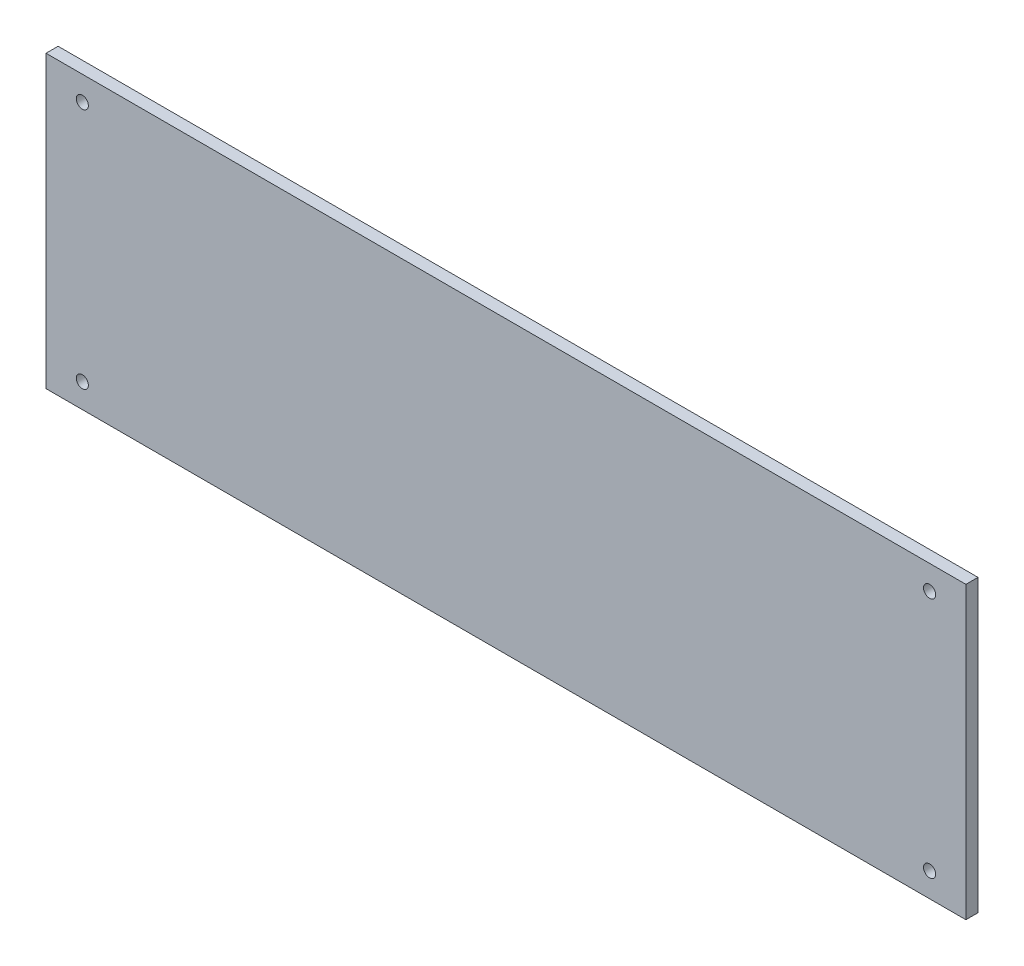
ISO-10303-21;
HEADER;
FILE_DESCRIPTION(('STEP AP214'),'2;1');
FILE_NAME('part.step','',(''),(''),'','','');
FILE_SCHEMA(('AUTOMOTIVE_DESIGN { 1 0 10303 214 1 1 1 1 }'));
ENDSEC;
DATA;
#1=APPLICATION_CONTEXT('core data for automotive mechanical design processes');
#2=APPLICATION_PROTOCOL_DEFINITION('international standard','automotive_design',2000,#1);
#3=PRODUCT_CONTEXT('',#1,'mechanical');
#4=PRODUCT('Part','Part','',(#3));
#5=PRODUCT_RELATED_PRODUCT_CATEGORY('part','',(#4));
#6=PRODUCT_DEFINITION_FORMATION('','',#4);
#7=PRODUCT_DEFINITION_CONTEXT('part definition',#1,'design');
#8=PRODUCT_DEFINITION('design','',#6,#7);
#9=PRODUCT_DEFINITION_SHAPE('','',#8);
#10=(LENGTH_UNIT() NAMED_UNIT(*) SI_UNIT(.MILLI.,.METRE.));
#11=(NAMED_UNIT(*) PLANE_ANGLE_UNIT() SI_UNIT($,.RADIAN.));
#12=(NAMED_UNIT(*) SI_UNIT($,.STERADIAN.) SOLID_ANGLE_UNIT());
#13=UNCERTAINTY_MEASURE_WITH_UNIT(LENGTH_MEASURE(1.E-05),#10,'distance_accuracy_value','');
#14=(GEOMETRIC_REPRESENTATION_CONTEXT(3) GLOBAL_UNCERTAINTY_ASSIGNED_CONTEXT((#13)) GLOBAL_UNIT_ASSIGNED_CONTEXT((#10,
#11,#12)) REPRESENTATION_CONTEXT('',''));
#15=CARTESIAN_POINT('',(0.,0.,0.));
#16=DIRECTION('',(0.,0.,1.));
#17=DIRECTION('',(1.,0.,0.));
#18=AXIS2_PLACEMENT_3D('',#15,#16,#17);
#19=CARTESIAN_POINT('',(241.3,-76.2,6.35));
#20=DIRECTION('',(-1.,0.,0.));
#21=DIRECTION('',(0.,0.,1.));
#22=AXIS2_PLACEMENT_3D('',#19,#20,#21);
#23=PLANE('',#22);
#24=DIRECTION('',(0.,1.,0.));
#25=VECTOR('',#24,1.);
#26=CARTESIAN_POINT('',(241.3,-76.2,0.));
#27=LINE('',#26,#25);
#28=CARTESIAN_POINT('',(241.3,-76.2,0.));
#29=VERTEX_POINT('',#28);
#30=CARTESIAN_POINT('',(241.3,76.2,0.));
#31=VERTEX_POINT('',#30);
#32=EDGE_CURVE('E111',#29,#31,#27,.T.);
#33=ORIENTED_EDGE('',*,*,#32,.T.);
#34=DIRECTION('',(0.,0.,-1.));
#35=VECTOR('',#34,1.);
#36=CARTESIAN_POINT('',(241.3,76.2,6.35));
#37=LINE('',#36,#35);
#38=CARTESIAN_POINT('',(241.3,76.2,6.35));
#39=VERTEX_POINT('',#38);
#40=EDGE_CURVE('E11',#39,#31,#37,.T.);
#41=ORIENTED_EDGE('',*,*,#40,.F.);
#42=DIRECTION('',(0.,1.,0.));
#43=VECTOR('',#42,1.);
#44=CARTESIAN_POINT('',(241.3,-76.2,6.35));
#45=LINE('',#44,#43);
#46=CARTESIAN_POINT('',(241.3,-76.2,6.35));
#47=VERTEX_POINT('',#46);
#48=EDGE_CURVE('E95',#47,#39,#45,.T.);
#49=ORIENTED_EDGE('',*,*,#48,.F.);
#50=DIRECTION('',(0.,0.,-1.));
#51=VECTOR('',#50,1.);
#52=CARTESIAN_POINT('',(241.3,-76.2,6.35));
#53=LINE('',#52,#51);
#54=EDGE_CURVE('E107',#47,#29,#53,.T.);
#55=ORIENTED_EDGE('',*,*,#54,.T.);
#56=EDGE_LOOP('',(#33,#41,#49,#55));
#57=FACE_BOUND('',#56,.T.);
#58=ADVANCED_FACE('F43',(#57),#23,.F.);
#59=CARTESIAN_POINT('',(-241.3,76.2,6.35));
#60=DIRECTION('',(0.,-1.,0.));
#61=DIRECTION('',(0.,0.,-1.));
#62=AXIS2_PLACEMENT_3D('',#59,#60,#61);
#63=PLANE('',#62);
#64=DIRECTION('',(-1.,0.,0.));
#65=VECTOR('',#64,1.);
#66=CARTESIAN_POINT('',(-241.3,76.2,0.));
#67=LINE('',#66,#65);
#68=CARTESIAN_POINT('',(-241.3,76.2,0.));
#69=VERTEX_POINT('',#68);
#70=EDGE_CURVE('E100',#31,#69,#67,.T.);
#71=ORIENTED_EDGE('',*,*,#70,.T.);
#72=DIRECTION('',(0.,0.,-1.));
#73=VECTOR('',#72,1.);
#74=CARTESIAN_POINT('',(-241.3,76.2,6.35));
#75=LINE('',#74,#73);
#76=CARTESIAN_POINT('',(-241.3,76.2,6.35));
#77=VERTEX_POINT('',#76);
#78=EDGE_CURVE('E52',#77,#69,#75,.T.);
#79=ORIENTED_EDGE('',*,*,#78,.F.);
#80=DIRECTION('',(-1.,0.,0.));
#81=VECTOR('',#80,1.);
#82=CARTESIAN_POINT('',(-241.3,76.2,6.35));
#83=LINE('',#82,#81);
#84=EDGE_CURVE('E90',#39,#77,#83,.T.);
#85=ORIENTED_EDGE('',*,*,#84,.F.);
#86=ORIENTED_EDGE('',*,*,#40,.T.);
#87=EDGE_LOOP('',(#71,#79,#85,#86));
#88=FACE_BOUND('',#87,.T.);
#89=ADVANCED_FACE('F99',(#88),#63,.F.);
#90=CARTESIAN_POINT('',(-241.3,-76.2,6.35));
#91=DIRECTION('',(1.,0.,0.));
#92=DIRECTION('',(0.,0.,-1.));
#93=AXIS2_PLACEMENT_3D('',#90,#91,#92);
#94=PLANE('',#93);
#95=DIRECTION('',(0.,-1.,0.));
#96=VECTOR('',#95,1.);
#97=CARTESIAN_POINT('',(-241.3,-76.2,0.));
#98=LINE('',#97,#96);
#99=CARTESIAN_POINT('',(-241.3,-76.2,0.));
#100=VERTEX_POINT('',#99);
#101=EDGE_CURVE('E77',#69,#100,#98,.T.);
#102=ORIENTED_EDGE('',*,*,#101,.T.);
#103=DIRECTION('',(0.,0.,-1.));
#104=VECTOR('',#103,1.);
#105=CARTESIAN_POINT('',(-241.3,-76.2,6.35));
#106=LINE('',#105,#104);
#107=CARTESIAN_POINT('',(-241.3,-76.2,6.35));
#108=VERTEX_POINT('',#107);
#109=EDGE_CURVE('E102',#108,#100,#106,.T.);
#110=ORIENTED_EDGE('',*,*,#109,.F.);
#111=DIRECTION('',(0.,-1.,0.));
#112=VECTOR('',#111,1.);
#113=CARTESIAN_POINT('',(-241.3,-76.2,6.35));
#114=LINE('',#113,#112);
#115=EDGE_CURVE('E93',#77,#108,#114,.T.);
#116=ORIENTED_EDGE('',*,*,#115,.F.);
#117=ORIENTED_EDGE('',*,*,#78,.T.);
#118=EDGE_LOOP('',(#102,#110,#116,#117));
#119=FACE_BOUND('',#118,.T.);
#120=ADVANCED_FACE('F103',(#119),#94,.F.);
#121=CARTESIAN_POINT('',(-241.3,-76.2,6.35));
#122=DIRECTION('',(0.,1.,0.));
#123=DIRECTION('',(0.,0.,1.));
#124=AXIS2_PLACEMENT_3D('',#121,#122,#123);
#125=PLANE('',#124);
#126=DIRECTION('',(1.,0.,0.));
#127=VECTOR('',#126,1.);
#128=CARTESIAN_POINT('',(-241.3,-76.2,0.));
#129=LINE('',#128,#127);
#130=EDGE_CURVE('E83',#100,#29,#129,.T.);
#131=ORIENTED_EDGE('',*,*,#130,.T.);
#132=ORIENTED_EDGE('',*,*,#54,.F.);
#133=DIRECTION('',(1.,0.,0.));
#134=VECTOR('',#133,1.);
#135=CARTESIAN_POINT('',(-241.3,-76.2,6.35));
#136=LINE('',#135,#134);
#137=EDGE_CURVE('E60',#108,#47,#136,.T.);
#138=ORIENTED_EDGE('',*,*,#137,.F.);
#139=ORIENTED_EDGE('',*,*,#109,.T.);
#140=EDGE_LOOP('',(#131,#132,#138,#139));
#141=FACE_BOUND('',#140,.T.);
#142=ADVANCED_FACE('F125',(#141),#125,.F.);
#143=CARTESIAN_POINT('',(0.,0.,6.35));
#144=DIRECTION('',(0.,0.,-1.));
#145=DIRECTION('',(-1.,0.,0.));
#146=AXIS2_PLACEMENT_3D('',#143,#144,#145);
#147=PLANE('',#146);
#148=CARTESIAN_POINT('',(222.25,63.5,6.35));
#149=DIRECTION('',(0.,0.,1.));
#150=DIRECTION('',(-1.,0.,0.));
#151=AXIS2_PLACEMENT_3D('',#148,#149,#150);
#152=CIRCLE('',#151,3.175);
#153=CARTESIAN_POINT('',(219.075,63.5,6.35));
#154=VERTEX_POINT('',#153);
#155=EDGE_CURVE('E156',#154,#154,#152,.T.);
#156=ORIENTED_EDGE('',*,*,#155,.F.);
#157=EDGE_LOOP('',(#156));
#158=FACE_BOUND('',#157,.T.);
#159=CARTESIAN_POINT('',(222.25,-63.5,6.35));
#160=DIRECTION('',(0.,0.,-1.));
#161=DIRECTION('',(-1.,0.,0.));
#162=AXIS2_PLACEMENT_3D('',#159,#160,#161);
#163=CIRCLE('',#162,3.175);
#164=CARTESIAN_POINT('',(219.075,-63.5,6.35));
#165=VERTEX_POINT('',#164);
#166=EDGE_CURVE('E148',#165,#165,#163,.T.);
#167=ORIENTED_EDGE('',*,*,#166,.T.);
#168=EDGE_LOOP('',(#167));
#169=FACE_BOUND('',#168,.T.);
#170=CARTESIAN_POINT('',(-222.25,63.5,6.35));
#171=DIRECTION('',(0.,0.,-1.));
#172=DIRECTION('',(1.,0.,0.));
#173=AXIS2_PLACEMENT_3D('',#170,#171,#172);
#174=CIRCLE('',#173,3.175);
#175=CARTESIAN_POINT('',(-219.075,63.5,6.35));
#176=VERTEX_POINT('',#175);
#177=EDGE_CURVE('E140',#176,#176,#174,.T.);
#178=ORIENTED_EDGE('',*,*,#177,.T.);
#179=EDGE_LOOP('',(#178));
#180=FACE_BOUND('',#179,.T.);
#181=CARTESIAN_POINT('',(-222.25,-63.5,6.35));
#182=DIRECTION('',(0.,0.,1.));
#183=DIRECTION('',(1.,0.,0.));
#184=AXIS2_PLACEMENT_3D('',#181,#182,#183);
#185=CIRCLE('',#184,3.175);
#186=CARTESIAN_POINT('',(-219.075,-63.5,6.35));
#187=VERTEX_POINT('',#186);
#188=EDGE_CURVE('E132',#187,#187,#185,.T.);
#189=ORIENTED_EDGE('',*,*,#188,.F.);
#190=EDGE_LOOP('',(#189));
#191=FACE_BOUND('',#190,.T.);
#192=ORIENTED_EDGE('',*,*,#48,.T.);
#193=ORIENTED_EDGE('',*,*,#84,.T.);
#194=ORIENTED_EDGE('',*,*,#115,.T.);
#195=ORIENTED_EDGE('',*,*,#137,.T.);
#196=EDGE_LOOP('',(#192,#193,#194,#195));
#197=FACE_BOUND('',#196,.T.);
#198=ADVANCED_FACE('F91',(#158,#169,#180,#191,#197),#147,.F.);
#199=CARTESIAN_POINT('',(0.,0.,0.));
#200=DIRECTION('',(0.,0.,-1.));
#201=DIRECTION('',(-1.,0.,0.));
#202=AXIS2_PLACEMENT_3D('',#199,#200,#201);
#203=PLANE('',#202);
#204=CARTESIAN_POINT('',(222.25,63.5,0.));
#205=DIRECTION('',(0.,0.,1.));
#206=DIRECTION('',(-1.,0.,0.));
#207=AXIS2_PLACEMENT_3D('',#204,#205,#206);
#208=CIRCLE('',#207,3.175);
#209=CARTESIAN_POINT('',(219.075,63.5,0.));
#210=VERTEX_POINT('',#209);
#211=EDGE_CURVE('E152',#210,#210,#208,.T.);
#212=ORIENTED_EDGE('',*,*,#211,.T.);
#213=EDGE_LOOP('',(#212));
#214=FACE_BOUND('',#213,.T.);
#215=CARTESIAN_POINT('',(222.25,-63.5,0.));
#216=DIRECTION('',(0.,0.,-1.));
#217=DIRECTION('',(-1.,0.,0.));
#218=AXIS2_PLACEMENT_3D('',#215,#216,#217);
#219=CIRCLE('',#218,3.175);
#220=CARTESIAN_POINT('',(219.075,-63.5,0.));
#221=VERTEX_POINT('',#220);
#222=EDGE_CURVE('E144',#221,#221,#219,.T.);
#223=ORIENTED_EDGE('',*,*,#222,.F.);
#224=EDGE_LOOP('',(#223));
#225=FACE_BOUND('',#224,.T.);
#226=CARTESIAN_POINT('',(-222.25,63.5,0.));
#227=DIRECTION('',(0.,0.,-1.));
#228=DIRECTION('',(1.,0.,0.));
#229=AXIS2_PLACEMENT_3D('',#226,#227,#228);
#230=CIRCLE('',#229,3.175);
#231=CARTESIAN_POINT('',(-219.075,63.5,0.));
#232=VERTEX_POINT('',#231);
#233=EDGE_CURVE('E136',#232,#232,#230,.T.);
#234=ORIENTED_EDGE('',*,*,#233,.F.);
#235=EDGE_LOOP('',(#234));
#236=FACE_BOUND('',#235,.T.);
#237=CARTESIAN_POINT('',(-222.25,-63.5,0.));
#238=DIRECTION('',(0.,0.,1.));
#239=DIRECTION('',(1.,0.,0.));
#240=AXIS2_PLACEMENT_3D('',#237,#238,#239);
#241=CIRCLE('',#240,3.175);
#242=CARTESIAN_POINT('',(-219.075,-63.5,0.));
#243=VERTEX_POINT('',#242);
#244=EDGE_CURVE('E115',#243,#243,#241,.T.);
#245=ORIENTED_EDGE('',*,*,#244,.T.);
#246=EDGE_LOOP('',(#245));
#247=FACE_BOUND('',#246,.T.);
#248=ORIENTED_EDGE('',*,*,#32,.F.);
#249=ORIENTED_EDGE('',*,*,#130,.F.);
#250=ORIENTED_EDGE('',*,*,#101,.F.);
#251=ORIENTED_EDGE('',*,*,#70,.F.);
#252=EDGE_LOOP('',(#248,#249,#250,#251));
#253=FACE_BOUND('',#252,.T.);
#254=ADVANCED_FACE('F128',(#214,#225,#236,#247,#253),#203,.T.);
#255=CARTESIAN_POINT('',(-222.25,-63.5,0.));
#256=DIRECTION('',(0.,0.,1.));
#257=DIRECTION('',(1.,0.,0.));
#258=AXIS2_PLACEMENT_3D('',#255,#256,#257);
#259=CYLINDRICAL_SURFACE('',#258,3.175);
#260=ORIENTED_EDGE('',*,*,#244,.F.);
#261=EDGE_LOOP('',(#260));
#262=FACE_BOUND('',#261,.T.);
#263=ORIENTED_EDGE('',*,*,#188,.T.);
#264=EDGE_LOOP('',(#263));
#265=FACE_BOUND('',#264,.T.);
#266=ADVANCED_FACE('F182',(#262,#265),#259,.F.);
#267=CARTESIAN_POINT('',(-222.25,63.5,0.));
#268=DIRECTION('',(0.,0.,1.));
#269=DIRECTION('',(1.,0.,0.));
#270=AXIS2_PLACEMENT_3D('',#267,#268,#269);
#271=CYLINDRICAL_SURFACE('',#270,3.175);
#272=ORIENTED_EDGE('',*,*,#233,.T.);
#273=EDGE_LOOP('',(#272));
#274=FACE_BOUND('',#273,.T.);
#275=ORIENTED_EDGE('',*,*,#177,.F.);
#276=EDGE_LOOP('',(#275));
#277=FACE_BOUND('',#276,.T.);
#278=ADVANCED_FACE('F184',(#274,#277),#271,.F.);
#279=CARTESIAN_POINT('',(222.25,-63.5,0.));
#280=DIRECTION('',(0.,0.,1.));
#281=DIRECTION('',(1.,0.,0.));
#282=AXIS2_PLACEMENT_3D('',#279,#280,#281);
#283=CYLINDRICAL_SURFACE('',#282,3.175);
#284=ORIENTED_EDGE('',*,*,#222,.T.);
#285=EDGE_LOOP('',(#284));
#286=FACE_BOUND('',#285,.T.);
#287=ORIENTED_EDGE('',*,*,#166,.F.);
#288=EDGE_LOOP('',(#287));
#289=FACE_BOUND('',#288,.T.);
#290=ADVANCED_FACE('F169',(#286,#289),#283,.F.);
#291=CARTESIAN_POINT('',(222.25,63.5,0.));
#292=DIRECTION('',(0.,0.,1.));
#293=DIRECTION('',(1.,0.,0.));
#294=AXIS2_PLACEMENT_3D('',#291,#292,#293);
#295=CYLINDRICAL_SURFACE('',#294,3.175);
#296=ORIENTED_EDGE('',*,*,#211,.F.);
#297=EDGE_LOOP('',(#296));
#298=FACE_BOUND('',#297,.T.);
#299=ORIENTED_EDGE('',*,*,#155,.T.);
#300=EDGE_LOOP('',(#299));
#301=FACE_BOUND('',#300,.T.);
#302=ADVANCED_FACE('F166',(#298,#301),#295,.F.);
#303=CLOSED_SHELL('',(#58,#89,#120,#142,#198,#254,#266,#278,#290,#302));
#304=MANIFOLD_SOLID_BREP('B2',#303);
#305=ADVANCED_BREP_SHAPE_REPRESENTATION('',(#18,#304),#14);
#306=SHAPE_DEFINITION_REPRESENTATION(#9,#305);
ENDSEC;
END-ISO-10303-21;
